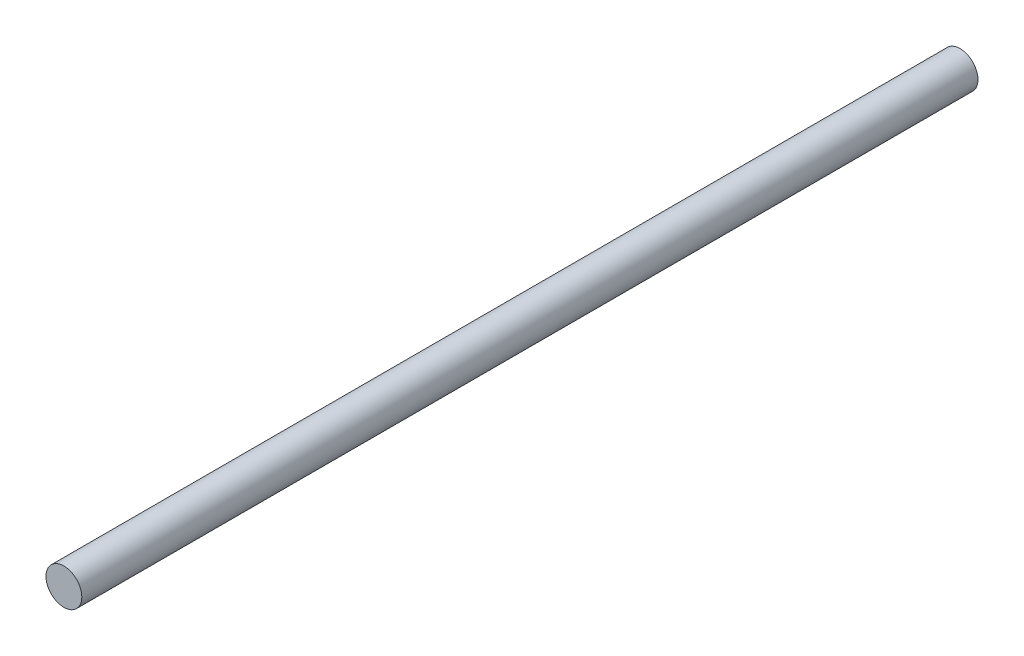
ISO-10303-21;
HEADER;
FILE_DESCRIPTION(('STEP AP214'),'2;1');
FILE_NAME('part.step','',(''),(''),'','','');
FILE_SCHEMA(('AUTOMOTIVE_DESIGN { 1 0 10303 214 1 1 1 1 }'));
ENDSEC;
DATA;
#1=APPLICATION_CONTEXT('core data for automotive mechanical design processes');
#2=APPLICATION_PROTOCOL_DEFINITION('international standard','automotive_design',2000,#1);
#3=PRODUCT_CONTEXT('',#1,'mechanical');
#4=PRODUCT('Part','Part','',(#3));
#5=PRODUCT_RELATED_PRODUCT_CATEGORY('part','',(#4));
#6=PRODUCT_DEFINITION_FORMATION('','',#4);
#7=PRODUCT_DEFINITION_CONTEXT('part definition',#1,'design');
#8=PRODUCT_DEFINITION('design','',#6,#7);
#9=PRODUCT_DEFINITION_SHAPE('','',#8);
#10=(LENGTH_UNIT() NAMED_UNIT(*) SI_UNIT(.MILLI.,.METRE.));
#11=(NAMED_UNIT(*) PLANE_ANGLE_UNIT() SI_UNIT($,.RADIAN.));
#12=(NAMED_UNIT(*) SI_UNIT($,.STERADIAN.) SOLID_ANGLE_UNIT());
#13=UNCERTAINTY_MEASURE_WITH_UNIT(LENGTH_MEASURE(1.E-05),#10,'distance_accuracy_value','');
#14=(GEOMETRIC_REPRESENTATION_CONTEXT(3) GLOBAL_UNCERTAINTY_ASSIGNED_CONTEXT((#13)) GLOBAL_UNIT_ASSIGNED_CONTEXT((#10,
#11,#12)) REPRESENTATION_CONTEXT('',''));
#15=CARTESIAN_POINT('',(0.,0.,0.));
#16=DIRECTION('',(0.,0.,1.));
#17=DIRECTION('',(1.,0.,0.));
#18=AXIS2_PLACEMENT_3D('',#15,#16,#17);
#19=CARTESIAN_POINT('',(0.,0.,250.));
#20=DIRECTION('',(0.,0.,-1.));
#21=DIRECTION('',(-1.,0.,0.));
#22=AXIS2_PLACEMENT_3D('',#19,#20,#21);
#23=CYLINDRICAL_SURFACE('',#22,5.);
#24=CARTESIAN_POINT('',(0.,0.,250.));
#25=DIRECTION('',(0.,0.,1.));
#26=DIRECTION('',(1.,0.,0.));
#27=AXIS2_PLACEMENT_3D('',#24,#25,#26);
#28=CIRCLE('',#27,5.);
#29=CARTESIAN_POINT('',(5.,0.,250.));
#30=VERTEX_POINT('',#29);
#31=EDGE_CURVE('E10',#30,#30,#28,.T.);
#32=ORIENTED_EDGE('',*,*,#31,.F.);
#33=EDGE_LOOP('',(#32));
#34=FACE_BOUND('',#33,.T.);
#35=CARTESIAN_POINT('',(0.,0.,0.));
#36=DIRECTION('',(0.,0.,1.));
#37=DIRECTION('',(1.,0.,0.));
#38=AXIS2_PLACEMENT_3D('',#35,#36,#37);
#39=CIRCLE('',#38,5.);
#40=CARTESIAN_POINT('',(5.,0.,0.));
#41=VERTEX_POINT('',#40);
#42=EDGE_CURVE('E36',#41,#41,#39,.T.);
#43=ORIENTED_EDGE('',*,*,#42,.T.);
#44=EDGE_LOOP('',(#43));
#45=FACE_BOUND('',#44,.T.);
#46=ADVANCED_FACE('F33',(#34,#45),#23,.T.);
#47=CARTESIAN_POINT('',(0.,0.,250.));
#48=DIRECTION('',(0.,0.,1.));
#49=DIRECTION('',(1.,0.,0.));
#50=AXIS2_PLACEMENT_3D('',#47,#48,#49);
#51=PLANE('',#50);
#52=ORIENTED_EDGE('',*,*,#31,.T.);
#53=EDGE_LOOP('',(#52));
#54=FACE_BOUND('',#53,.T.);
#55=ADVANCED_FACE('F48',(#54),#51,.T.);
#56=CARTESIAN_POINT('',(0.,0.,0.));
#57=DIRECTION('',(0.,0.,1.));
#58=DIRECTION('',(1.,0.,0.));
#59=AXIS2_PLACEMENT_3D('',#56,#57,#58);
#60=PLANE('',#59);
#61=ORIENTED_EDGE('',*,*,#42,.F.);
#62=EDGE_LOOP('',(#61));
#63=FACE_BOUND('',#62,.T.);
#64=ADVANCED_FACE('F46',(#63),#60,.F.);
#65=CLOSED_SHELL('',(#46,#55,#64));
#66=MANIFOLD_SOLID_BREP('B2',#65);
#67=ADVANCED_BREP_SHAPE_REPRESENTATION('',(#18,#66),#14);
#68=SHAPE_DEFINITION_REPRESENTATION(#9,#67);
ENDSEC;
END-ISO-10303-21;
